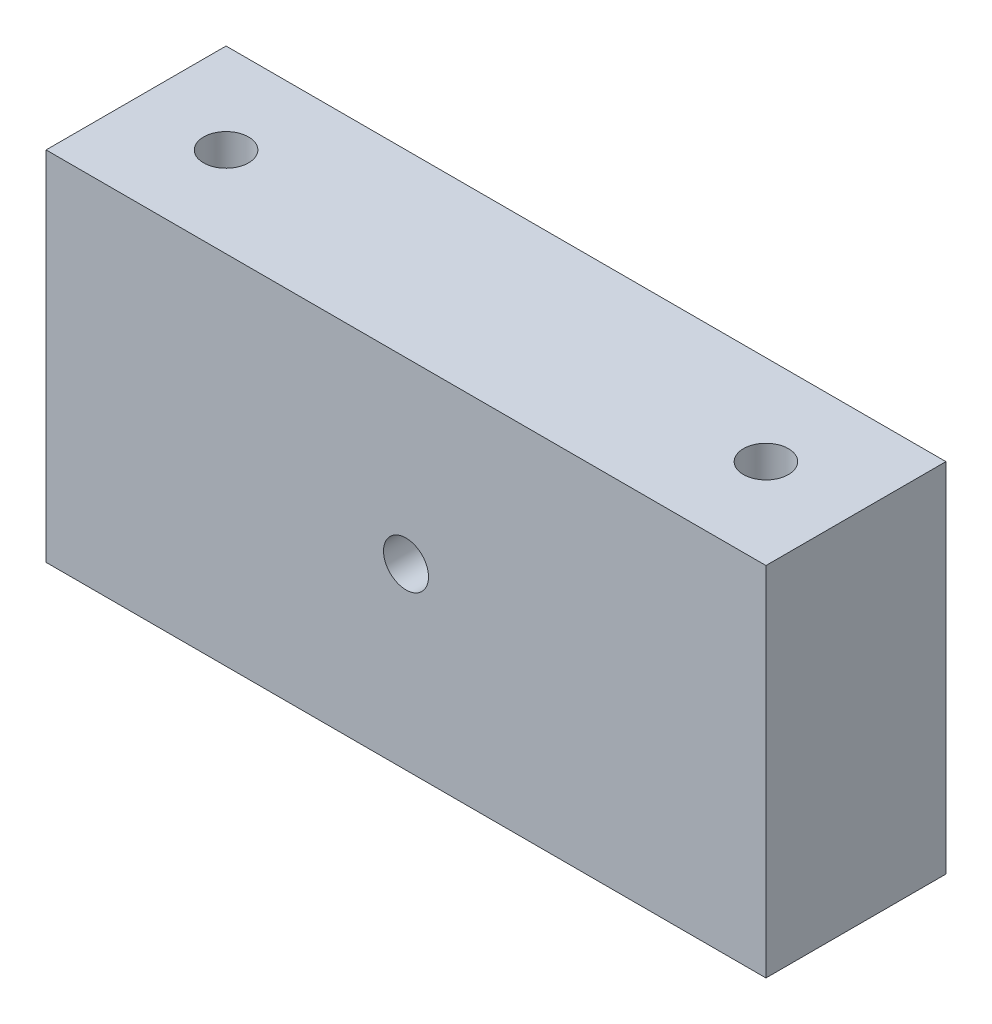
ISO-10303-21;
HEADER;
FILE_DESCRIPTION(('STEP AP214'),'2;1');
FILE_NAME('part.step','',(''),(''),'','','');
FILE_SCHEMA(('AUTOMOTIVE_DESIGN { 1 0 10303 214 1 1 1 1 }'));
ENDSEC;
DATA;
#1=APPLICATION_CONTEXT('core data for automotive mechanical design processes');
#2=APPLICATION_PROTOCOL_DEFINITION('international standard','automotive_design',2000,#1);
#3=PRODUCT_CONTEXT('',#1,'mechanical');
#4=PRODUCT('Part','Part','',(#3));
#5=PRODUCT_RELATED_PRODUCT_CATEGORY('part','',(#4));
#6=PRODUCT_DEFINITION_FORMATION('','',#4);
#7=PRODUCT_DEFINITION_CONTEXT('part definition',#1,'design');
#8=PRODUCT_DEFINITION('design','',#6,#7);
#9=PRODUCT_DEFINITION_SHAPE('','',#8);
#10=(LENGTH_UNIT() NAMED_UNIT(*) SI_UNIT(.MILLI.,.METRE.));
#11=(NAMED_UNIT(*) PLANE_ANGLE_UNIT() SI_UNIT($,.RADIAN.));
#12=(NAMED_UNIT(*) SI_UNIT($,.STERADIAN.) SOLID_ANGLE_UNIT());
#13=UNCERTAINTY_MEASURE_WITH_UNIT(LENGTH_MEASURE(1.E-05),#10,'distance_accuracy_value','');
#14=(GEOMETRIC_REPRESENTATION_CONTEXT(3) GLOBAL_UNCERTAINTY_ASSIGNED_CONTEXT((#13)) GLOBAL_UNIT_ASSIGNED_CONTEXT((#10,
#11,#12)) REPRESENTATION_CONTEXT('',''));
#15=CARTESIAN_POINT('',(0.,0.,0.));
#16=DIRECTION('',(0.,0.,1.));
#17=DIRECTION('',(1.,0.,0.));
#18=AXIS2_PLACEMENT_3D('',#15,#16,#17);
#19=CARTESIAN_POINT('',(0.,19.85,0.));
#20=DIRECTION('',(1.,0.,0.));
#21=DIRECTION('',(0.,0.,1.));
#22=AXIS2_PLACEMENT_3D('',#19,#20,#21);
#23=PLANE('',#22);
#24=DIRECTION('',(0.,0.,-1.));
#25=VECTOR('',#24,1.);
#26=CARTESIAN_POINT('',(0.,0.,0.));
#27=LINE('',#26,#25);
#28=CARTESIAN_POINT('',(0.,0.,10.));
#29=VERTEX_POINT('',#28);
#30=CARTESIAN_POINT('',(0.,0.,0.));
#31=VERTEX_POINT('',#30);
#32=EDGE_CURVE('E101',#29,#31,#27,.T.);
#33=ORIENTED_EDGE('',*,*,#32,.F.);
#34=DIRECTION('',(0.,-1.,0.));
#35=VECTOR('',#34,1.);
#36=CARTESIAN_POINT('',(0.,19.85,10.));
#37=LINE('',#36,#35);
#38=CARTESIAN_POINT('',(0.,19.85,10.));
#39=VERTEX_POINT('',#38);
#40=EDGE_CURVE('E100',#39,#29,#37,.T.);
#41=ORIENTED_EDGE('',*,*,#40,.F.);
#42=DIRECTION('',(0.,0.,-1.));
#43=VECTOR('',#42,1.);
#44=CARTESIAN_POINT('',(0.,19.85,0.));
#45=LINE('',#44,#43);
#46=CARTESIAN_POINT('',(0.,19.85,0.));
#47=VERTEX_POINT('',#46);
#48=EDGE_CURVE('E94',#39,#47,#45,.T.);
#49=ORIENTED_EDGE('',*,*,#48,.T.);
#50=DIRECTION('',(0.,-1.,0.));
#51=VECTOR('',#50,1.);
#52=CARTESIAN_POINT('',(0.,19.85,0.));
#53=LINE('',#52,#51);
#54=EDGE_CURVE('E11',#47,#31,#53,.T.);
#55=ORIENTED_EDGE('',*,*,#54,.T.);
#56=EDGE_LOOP('',(#33,#41,#49,#55));
#57=FACE_BOUND('',#56,.T.);
#58=ADVANCED_FACE('F37',(#57),#23,.F.);
#59=CARTESIAN_POINT('',(0.,19.85,0.));
#60=DIRECTION('',(0.,0.,1.));
#61=DIRECTION('',(-1.,0.,0.));
#62=AXIS2_PLACEMENT_3D('',#59,#60,#61);
#63=PLANE('',#62);
#64=CARTESIAN_POINT('',(20.,9.92500000000001,0.));
#65=DIRECTION('',(0.,0.,-1.));
#66=DIRECTION('',(-1.,0.,0.));
#67=AXIS2_PLACEMENT_3D('',#64,#65,#66);
#68=CIRCLE('',#67,1.25);
#69=CARTESIAN_POINT('',(18.75,9.92500000000001,0.));
#70=VERTEX_POINT('',#69);
#71=EDGE_CURVE('E135',#70,#70,#68,.T.);
#72=ORIENTED_EDGE('',*,*,#71,.F.);
#73=EDGE_LOOP('',(#72));
#74=FACE_BOUND('',#73,.T.);
#75=DIRECTION('',(1.,0.,0.));
#76=VECTOR('',#75,1.);
#77=CARTESIAN_POINT('',(0.,0.,0.));
#78=LINE('',#77,#76);
#79=CARTESIAN_POINT('',(40.,0.,0.));
#80=VERTEX_POINT('',#79);
#81=EDGE_CURVE('E103',#31,#80,#78,.T.);
#82=ORIENTED_EDGE('',*,*,#81,.F.);
#83=ORIENTED_EDGE('',*,*,#54,.F.);
#84=DIRECTION('',(1.,0.,0.));
#85=VECTOR('',#84,1.);
#86=CARTESIAN_POINT('',(0.,19.85,0.));
#87=LINE('',#86,#85);
#88=CARTESIAN_POINT('',(40.,19.85,0.));
#89=VERTEX_POINT('',#88);
#90=EDGE_CURVE('E78',#47,#89,#87,.T.);
#91=ORIENTED_EDGE('',*,*,#90,.T.);
#92=DIRECTION('',(0.,-1.,0.));
#93=VECTOR('',#92,1.);
#94=CARTESIAN_POINT('',(40.,19.85,0.));
#95=LINE('',#94,#93);
#96=EDGE_CURVE('E45',#89,#80,#95,.T.);
#97=ORIENTED_EDGE('',*,*,#96,.T.);
#98=EDGE_LOOP('',(#82,#83,#91,#97));
#99=FACE_BOUND('',#98,.T.);
#100=ADVANCED_FACE('F92',(#74,#99),#63,.F.);
#101=CARTESIAN_POINT('',(40.,19.85,0.));
#102=DIRECTION('',(-1.,0.,0.));
#103=DIRECTION('',(0.,0.,-1.));
#104=AXIS2_PLACEMENT_3D('',#101,#102,#103);
#105=PLANE('',#104);
#106=DIRECTION('',(0.,0.,1.));
#107=VECTOR('',#106,1.);
#108=CARTESIAN_POINT('',(40.,0.,0.));
#109=LINE('',#108,#107);
#110=CARTESIAN_POINT('',(40.,0.,10.));
#111=VERTEX_POINT('',#110);
#112=EDGE_CURVE('E88',#80,#111,#109,.T.);
#113=ORIENTED_EDGE('',*,*,#112,.F.);
#114=ORIENTED_EDGE('',*,*,#96,.F.);
#115=DIRECTION('',(0.,0.,1.));
#116=VECTOR('',#115,1.);
#117=CARTESIAN_POINT('',(40.,19.85,0.));
#118=LINE('',#117,#116);
#119=CARTESIAN_POINT('',(40.,19.85,10.));
#120=VERTEX_POINT('',#119);
#121=EDGE_CURVE('E81',#89,#120,#118,.T.);
#122=ORIENTED_EDGE('',*,*,#121,.T.);
#123=DIRECTION('',(0.,-1.,0.));
#124=VECTOR('',#123,1.);
#125=CARTESIAN_POINT('',(40.,19.85,10.));
#126=LINE('',#125,#124);
#127=EDGE_CURVE('E91',#120,#111,#126,.T.);
#128=ORIENTED_EDGE('',*,*,#127,.T.);
#129=EDGE_LOOP('',(#113,#114,#122,#128));
#130=FACE_BOUND('',#129,.T.);
#131=ADVANCED_FACE('F87',(#130),#105,.F.);
#132=CARTESIAN_POINT('',(0.,19.85,10.));
#133=DIRECTION('',(0.,0.,-1.));
#134=DIRECTION('',(1.,0.,0.));
#135=AXIS2_PLACEMENT_3D('',#132,#133,#134);
#136=PLANE('',#135);
#137=CARTESIAN_POINT('',(20.,9.92500000000001,10.));
#138=DIRECTION('',(0.,0.,-1.));
#139=DIRECTION('',(-1.,0.,0.));
#140=AXIS2_PLACEMENT_3D('',#137,#138,#139);
#141=CIRCLE('',#140,1.25);
#142=CARTESIAN_POINT('',(18.75,9.92500000000001,10.));
#143=VERTEX_POINT('',#142);
#144=EDGE_CURVE('E138',#143,#143,#141,.T.);
#145=ORIENTED_EDGE('',*,*,#144,.T.);
#146=EDGE_LOOP('',(#145));
#147=FACE_BOUND('',#146,.T.);
#148=DIRECTION('',(-1.,0.,0.));
#149=VECTOR('',#148,1.);
#150=CARTESIAN_POINT('',(0.,0.,10.));
#151=LINE('',#150,#149);
#152=EDGE_CURVE('E67',#111,#29,#151,.T.);
#153=ORIENTED_EDGE('',*,*,#152,.F.);
#154=ORIENTED_EDGE('',*,*,#127,.F.);
#155=DIRECTION('',(-1.,0.,0.));
#156=VECTOR('',#155,1.);
#157=CARTESIAN_POINT('',(0.,19.85,10.));
#158=LINE('',#157,#156);
#159=EDGE_CURVE('E53',#120,#39,#158,.T.);
#160=ORIENTED_EDGE('',*,*,#159,.T.);
#161=ORIENTED_EDGE('',*,*,#40,.T.);
#162=EDGE_LOOP('',(#153,#154,#160,#161));
#163=FACE_BOUND('',#162,.T.);
#164=ADVANCED_FACE('F113',(#147,#163),#136,.F.);
#165=CARTESIAN_POINT('',(0.,19.85,0.));
#166=DIRECTION('',(0.,-1.,0.));
#167=DIRECTION('',(0.,0.,1.));
#168=AXIS2_PLACEMENT_3D('',#165,#166,#167);
#169=PLANE('',#168);
#170=CARTESIAN_POINT('',(5.,19.85,5.));
#171=DIRECTION('',(0.,-1.,0.));
#172=DIRECTION('',(0.,0.,-1.));
#173=AXIS2_PLACEMENT_3D('',#170,#171,#172);
#174=CIRCLE('',#173,1.25);
#175=CARTESIAN_POINT('',(5.,19.85,3.75));
#176=VERTEX_POINT('',#175);
#177=EDGE_CURVE('E137',#176,#176,#174,.T.);
#178=ORIENTED_EDGE('',*,*,#177,.T.);
#179=EDGE_LOOP('',(#178));
#180=FACE_BOUND('',#179,.T.);
#181=CARTESIAN_POINT('',(35.,19.85,5.));
#182=DIRECTION('',(0.,-1.,0.));
#183=DIRECTION('',(0.,0.,-1.));
#184=AXIS2_PLACEMENT_3D('',#181,#182,#183);
#185=CIRCLE('',#184,1.25);
#186=CARTESIAN_POINT('',(35.,19.85,3.75));
#187=VERTEX_POINT('',#186);
#188=EDGE_CURVE('E147',#187,#187,#185,.T.);
#189=ORIENTED_EDGE('',*,*,#188,.T.);
#190=EDGE_LOOP('',(#189));
#191=FACE_BOUND('',#190,.T.);
#192=ORIENTED_EDGE('',*,*,#48,.F.);
#193=ORIENTED_EDGE('',*,*,#159,.F.);
#194=ORIENTED_EDGE('',*,*,#121,.F.);
#195=ORIENTED_EDGE('',*,*,#90,.F.);
#196=EDGE_LOOP('',(#192,#193,#194,#195));
#197=FACE_BOUND('',#196,.T.);
#198=ADVANCED_FACE('F83',(#180,#191,#197),#169,.F.);
#199=CARTESIAN_POINT('',(0.,0.,0.));
#200=DIRECTION('',(0.,-1.,0.));
#201=DIRECTION('',(0.,0.,1.));
#202=AXIS2_PLACEMENT_3D('',#199,#200,#201);
#203=PLANE('',#202);
#204=CARTESIAN_POINT('',(5.,0.,5.));
#205=DIRECTION('',(0.,-1.,0.));
#206=DIRECTION('',(0.,0.,-1.));
#207=AXIS2_PLACEMENT_3D('',#204,#205,#206);
#208=CIRCLE('',#207,1.25);
#209=CARTESIAN_POINT('',(5.,0.,3.75));
#210=VERTEX_POINT('',#209);
#211=EDGE_CURVE('E141',#210,#210,#208,.T.);
#212=ORIENTED_EDGE('',*,*,#211,.F.);
#213=EDGE_LOOP('',(#212));
#214=FACE_BOUND('',#213,.T.);
#215=CARTESIAN_POINT('',(35.,0.,5.));
#216=DIRECTION('',(0.,-1.,0.));
#217=DIRECTION('',(0.,0.,-1.));
#218=AXIS2_PLACEMENT_3D('',#215,#216,#217);
#219=CIRCLE('',#218,1.24999999999999);
#220=CARTESIAN_POINT('',(35.,0.,3.75000000000001));
#221=VERTEX_POINT('',#220);
#222=EDGE_CURVE('E104',#221,#221,#219,.T.);
#223=ORIENTED_EDGE('',*,*,#222,.F.);
#224=EDGE_LOOP('',(#223));
#225=FACE_BOUND('',#224,.T.);
#226=ORIENTED_EDGE('',*,*,#32,.T.);
#227=ORIENTED_EDGE('',*,*,#81,.T.);
#228=ORIENTED_EDGE('',*,*,#112,.T.);
#229=ORIENTED_EDGE('',*,*,#152,.T.);
#230=EDGE_LOOP('',(#226,#227,#228,#229));
#231=FACE_BOUND('',#230,.T.);
#232=ADVANCED_FACE('F109',(#214,#225,#231),#203,.T.);
#233=CARTESIAN_POINT('',(35.,19.85,5.));
#234=DIRECTION('',(0.,1.,0.));
#235=DIRECTION('',(0.,0.,-1.));
#236=AXIS2_PLACEMENT_3D('',#233,#234,#235);
#237=CYLINDRICAL_SURFACE('',#236,1.25);
#238=ORIENTED_EDGE('',*,*,#222,.T.);
#239=EDGE_LOOP('',(#238));
#240=FACE_BOUND('',#239,.T.);
#241=ORIENTED_EDGE('',*,*,#188,.F.);
#242=EDGE_LOOP('',(#241));
#243=FACE_BOUND('',#242,.T.);
#244=ADVANCED_FACE('F152',(#240,#243),#237,.F.);
#245=CARTESIAN_POINT('',(5.,19.85,5.));
#246=DIRECTION('',(0.,1.,0.));
#247=DIRECTION('',(0.,0.,-1.));
#248=AXIS2_PLACEMENT_3D('',#245,#246,#247);
#249=CYLINDRICAL_SURFACE('',#248,1.25);
#250=ORIENTED_EDGE('',*,*,#211,.T.);
#251=EDGE_LOOP('',(#250));
#252=FACE_BOUND('',#251,.T.);
#253=ORIENTED_EDGE('',*,*,#177,.F.);
#254=EDGE_LOOP('',(#253));
#255=FACE_BOUND('',#254,.T.);
#256=ADVANCED_FACE('F160',(#252,#255),#249,.F.);
#257=CARTESIAN_POINT('',(20.,9.92500000000001,10.));
#258=DIRECTION('',(0.,0.,1.));
#259=DIRECTION('',(-1.,0.,0.));
#260=AXIS2_PLACEMENT_3D('',#257,#258,#259);
#261=CYLINDRICAL_SURFACE('',#260,1.25);
#262=ORIENTED_EDGE('',*,*,#71,.T.);
#263=EDGE_LOOP('',(#262));
#264=FACE_BOUND('',#263,.T.);
#265=ORIENTED_EDGE('',*,*,#144,.F.);
#266=EDGE_LOOP('',(#265));
#267=FACE_BOUND('',#266,.T.);
#268=ADVANCED_FACE('F166',(#264,#267),#261,.F.);
#269=CLOSED_SHELL('',(#58,#100,#131,#164,#198,#232,#244,#256,#268));
#270=MANIFOLD_SOLID_BREP('B2',#269);
#271=ADVANCED_BREP_SHAPE_REPRESENTATION('',(#18,#270),#14);
#272=SHAPE_DEFINITION_REPRESENTATION(#9,#271);
ENDSEC;
END-ISO-10303-21;
